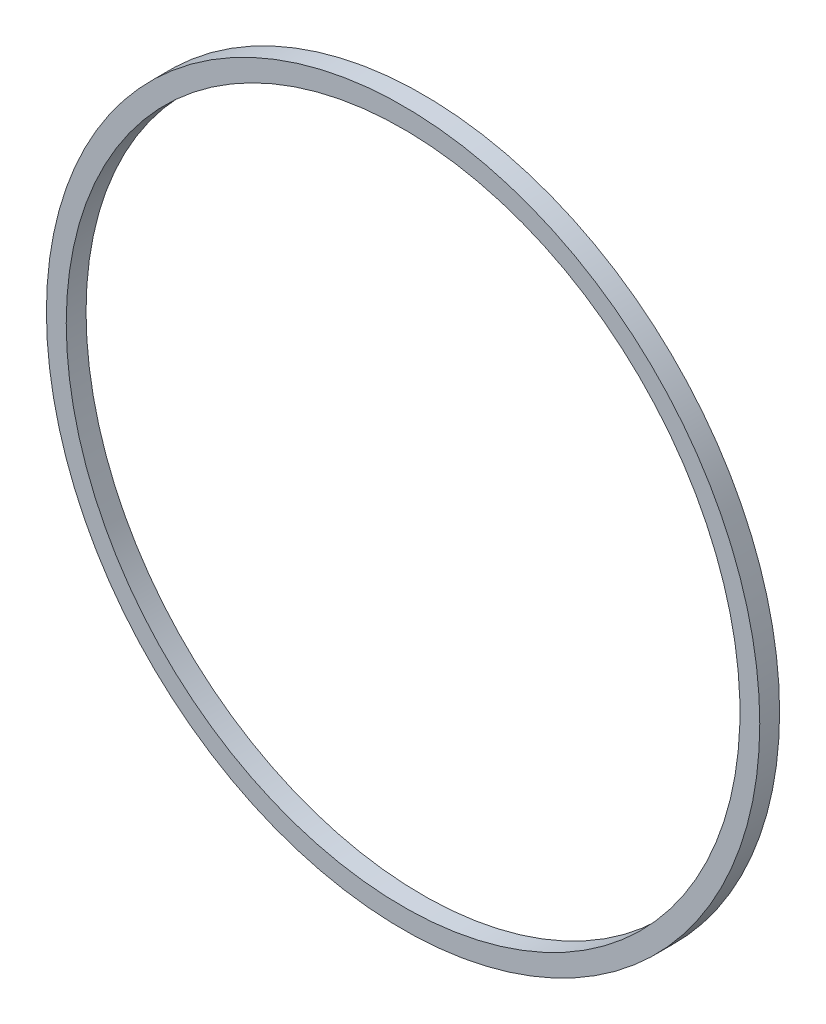
ISO-10303-21;
HEADER;
FILE_DESCRIPTION(('STEP AP214'),'2;1');
FILE_NAME('part.step','',(''),(''),'','','');
FILE_SCHEMA(('AUTOMOTIVE_DESIGN { 1 0 10303 214 1 1 1 1 }'));
ENDSEC;
DATA;
#1=APPLICATION_CONTEXT('core data for automotive mechanical design processes');
#2=APPLICATION_PROTOCOL_DEFINITION('international standard','automotive_design',2000,#1);
#3=PRODUCT_CONTEXT('',#1,'mechanical');
#4=PRODUCT('Part','Part','',(#3));
#5=PRODUCT_RELATED_PRODUCT_CATEGORY('part','',(#4));
#6=PRODUCT_DEFINITION_FORMATION('','',#4);
#7=PRODUCT_DEFINITION_CONTEXT('part definition',#1,'design');
#8=PRODUCT_DEFINITION('design','',#6,#7);
#9=PRODUCT_DEFINITION_SHAPE('','',#8);
#10=(LENGTH_UNIT() NAMED_UNIT(*) SI_UNIT(.MILLI.,.METRE.));
#11=(NAMED_UNIT(*) PLANE_ANGLE_UNIT() SI_UNIT($,.RADIAN.));
#12=(NAMED_UNIT(*) SI_UNIT($,.STERADIAN.) SOLID_ANGLE_UNIT());
#13=UNCERTAINTY_MEASURE_WITH_UNIT(LENGTH_MEASURE(1.E-05),#10,'distance_accuracy_value','');
#14=(GEOMETRIC_REPRESENTATION_CONTEXT(3) GLOBAL_UNCERTAINTY_ASSIGNED_CONTEXT((#13)) GLOBAL_UNIT_ASSIGNED_CONTEXT((#10,
#11,#12)) REPRESENTATION_CONTEXT('',''));
#15=CARTESIAN_POINT('',(0.,0.,0.));
#16=DIRECTION('',(0.,0.,1.));
#17=DIRECTION('',(1.,0.,0.));
#18=AXIS2_PLACEMENT_3D('',#15,#16,#17);
#19=CARTESIAN_POINT('',(0.,0.,0.));
#20=DIRECTION('',(0.,0.,1.));
#21=DIRECTION('',(1.,0.,0.));
#22=AXIS2_PLACEMENT_3D('',#19,#20,#21);
#23=CYLINDRICAL_SURFACE('',#22,647.7);
#24=DIRECTION('',(0.,0.,-1.));
#25=VECTOR('',#24,1.);
#26=CARTESIAN_POINT('',(-647.7,0.,19.05));
#27=LINE('',#26,#25);
#28=CARTESIAN_POINT('',(-647.7,0.,19.05));
#29=VERTEX_POINT('',#28);
#30=CARTESIAN_POINT('',(-647.7,0.,-19.0500000000001));
#31=VERTEX_POINT('',#30);
#32=EDGE_CURVE('E74',#29,#31,#27,.T.);
#33=ORIENTED_EDGE('',*,*,#32,.T.);
#34=CARTESIAN_POINT('',(0.,0.,-19.0500000000001));
#35=DIRECTION('',(0.,0.,1.));
#36=DIRECTION('',(-1.,0.,0.));
#37=AXIS2_PLACEMENT_3D('',#34,#35,#36);
#38=CIRCLE('',#37,647.7);
#39=EDGE_CURVE('E77',#31,#31,#38,.T.);
#40=ORIENTED_EDGE('',*,*,#39,.F.);
#41=ORIENTED_EDGE('',*,*,#32,.F.);
#42=CARTESIAN_POINT('',(0.,0.,19.05));
#43=DIRECTION('',(0.,0.,1.));
#44=DIRECTION('',(-1.,0.,0.));
#45=AXIS2_PLACEMENT_3D('',#42,#43,#44);
#46=CIRCLE('',#45,647.7);
#47=EDGE_CURVE('E76',#29,#29,#46,.T.);
#48=ORIENTED_EDGE('',*,*,#47,.T.);
#49=EDGE_LOOP('',(#33,#40,#41,#48));
#50=FACE_BOUND('',#49,.T.);
#51=ADVANCED_FACE('F37',(#50),#23,.F.);
#52=CARTESIAN_POINT('',(-685.8,0.,-19.0500000000001));
#53=DIRECTION('',(0.,0.,1.));
#54=DIRECTION('',(1.,0.,0.));
#55=AXIS2_PLACEMENT_3D('',#52,#53,#54);
#56=PLANE('',#55);
#57=ORIENTED_EDGE('',*,*,#39,.T.);
#58=EDGE_LOOP('',(#57));
#59=FACE_BOUND('',#58,.T.);
#60=CARTESIAN_POINT('',(0.,0.,-19.0500000000001));
#61=DIRECTION('',(0.,0.,1.));
#62=DIRECTION('',(-1.,0.,0.));
#63=AXIS2_PLACEMENT_3D('',#60,#61,#62);
#64=CIRCLE('',#63,685.8);
#65=CARTESIAN_POINT('',(-685.8,0.,-19.0500000000001));
#66=VERTEX_POINT('',#65);
#67=EDGE_CURVE('E47',#66,#66,#64,.T.);
#68=ORIENTED_EDGE('',*,*,#67,.F.);
#69=EDGE_LOOP('',(#68));
#70=FACE_BOUND('',#69,.T.);
#71=ADVANCED_FACE('F95',(#59,#70),#56,.F.);
#72=CARTESIAN_POINT('',(0.,0.,0.));
#73=DIRECTION('',(0.,0.,1.));
#74=DIRECTION('',(1.,0.,0.));
#75=AXIS2_PLACEMENT_3D('',#72,#73,#74);
#76=CYLINDRICAL_SURFACE('',#75,685.8);
#77=DIRECTION('',(0.,0.,1.));
#78=VECTOR('',#77,1.);
#79=CARTESIAN_POINT('',(-685.8,0.,19.05));
#80=LINE('',#79,#78);
#81=CARTESIAN_POINT('',(-685.8,0.,19.05));
#82=VERTEX_POINT('',#81);
#83=EDGE_CURVE('E57',#66,#82,#80,.T.);
#84=ORIENTED_EDGE('',*,*,#83,.T.);
#85=CARTESIAN_POINT('',(0.,0.,19.05));
#86=DIRECTION('',(0.,0.,1.));
#87=DIRECTION('',(-1.,0.,0.));
#88=AXIS2_PLACEMENT_3D('',#85,#86,#87);
#89=CIRCLE('',#88,685.8);
#90=EDGE_CURVE('E11',#82,#82,#89,.T.);
#91=ORIENTED_EDGE('',*,*,#90,.F.);
#92=ORIENTED_EDGE('',*,*,#83,.F.);
#93=ORIENTED_EDGE('',*,*,#67,.T.);
#94=EDGE_LOOP('',(#84,#91,#92,#93));
#95=FACE_BOUND('',#94,.T.);
#96=ADVANCED_FACE('F94',(#95),#76,.T.);
#97=CARTESIAN_POINT('',(-685.8,0.,19.05));
#98=DIRECTION('',(0.,0.,-1.));
#99=DIRECTION('',(-1.,0.,0.));
#100=AXIS2_PLACEMENT_3D('',#97,#98,#99);
#101=PLANE('',#100);
#102=ORIENTED_EDGE('',*,*,#90,.T.);
#103=EDGE_LOOP('',(#102));
#104=FACE_BOUND('',#103,.T.);
#105=ORIENTED_EDGE('',*,*,#47,.F.);
#106=EDGE_LOOP('',(#105));
#107=FACE_BOUND('',#106,.T.);
#108=ADVANCED_FACE('F39',(#104,#107),#101,.F.);
#109=CLOSED_SHELL('',(#51,#71,#96,#108));
#110=MANIFOLD_SOLID_BREP('B2',#109);
#111=ADVANCED_BREP_SHAPE_REPRESENTATION('',(#18,#110),#14);
#112=SHAPE_DEFINITION_REPRESENTATION(#9,#111);
ENDSEC;
END-ISO-10303-21;
